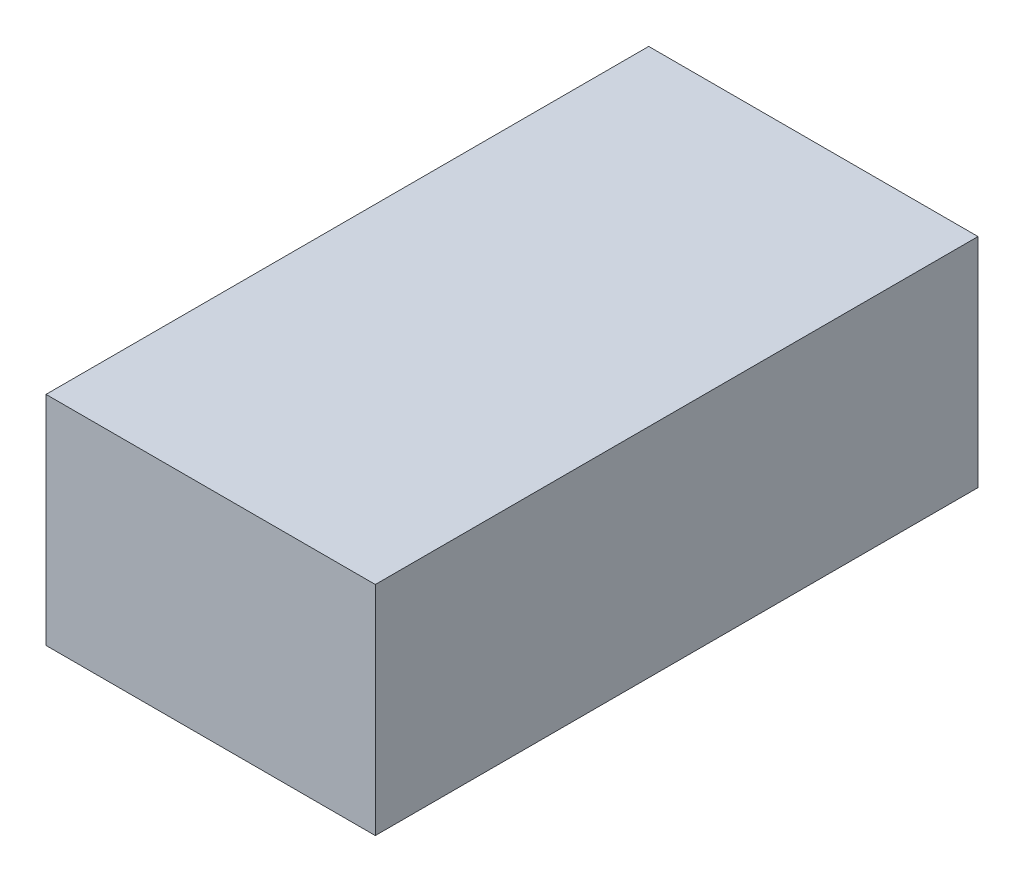
ISO-10303-21;
HEADER;
FILE_DESCRIPTION(('STEP AP214'),'2;1');
FILE_NAME('part.step','',(''),(''),'','','');
FILE_SCHEMA(('AUTOMOTIVE_DESIGN { 1 0 10303 214 1 1 1 1 }'));
ENDSEC;
DATA;
#1=APPLICATION_CONTEXT('core data for automotive mechanical design processes');
#2=APPLICATION_PROTOCOL_DEFINITION('international standard','automotive_design',2000,#1);
#3=PRODUCT_CONTEXT('',#1,'mechanical');
#4=PRODUCT('Part','Part','',(#3));
#5=PRODUCT_RELATED_PRODUCT_CATEGORY('part','',(#4));
#6=PRODUCT_DEFINITION_FORMATION('','',#4);
#7=PRODUCT_DEFINITION_CONTEXT('part definition',#1,'design');
#8=PRODUCT_DEFINITION('design','',#6,#7);
#9=PRODUCT_DEFINITION_SHAPE('','',#8);
#10=(LENGTH_UNIT() NAMED_UNIT(*) SI_UNIT(.MILLI.,.METRE.));
#11=(NAMED_UNIT(*) PLANE_ANGLE_UNIT() SI_UNIT($,.RADIAN.));
#12=(NAMED_UNIT(*) SI_UNIT($,.STERADIAN.) SOLID_ANGLE_UNIT());
#13=UNCERTAINTY_MEASURE_WITH_UNIT(LENGTH_MEASURE(1.E-05),#10,'distance_accuracy_value','');
#14=(GEOMETRIC_REPRESENTATION_CONTEXT(3) GLOBAL_UNCERTAINTY_ASSIGNED_CONTEXT((#13)) GLOBAL_UNIT_ASSIGNED_CONTEXT((#10,
#11,#12)) REPRESENTATION_CONTEXT('',''));
#15=CARTESIAN_POINT('',(0.,0.,0.));
#16=DIRECTION('',(0.,0.,1.));
#17=DIRECTION('',(1.,0.,0.));
#18=AXIS2_PLACEMENT_3D('',#15,#16,#17);
#19=CARTESIAN_POINT('',(0.,0.,48.5));
#20=DIRECTION('',(1.,0.,0.));
#21=DIRECTION('',(0.,1.,0.));
#22=AXIS2_PLACEMENT_3D('',#19,#20,#21);
#23=PLANE('',#22);
#24=DIRECTION('',(0.,-1.,0.));
#25=VECTOR('',#24,1.);
#26=CARTESIAN_POINT('',(0.,0.,0.));
#27=LINE('',#26,#25);
#28=CARTESIAN_POINT('',(0.,0.,0.));
#29=VERTEX_POINT('',#28);
#30=CARTESIAN_POINT('',(0.,-17.5,0.));
#31=VERTEX_POINT('',#30);
#32=EDGE_CURVE('E96',#29,#31,#27,.T.);
#33=ORIENTED_EDGE('',*,*,#32,.T.);
#34=DIRECTION('',(0.,0.,-1.));
#35=VECTOR('',#34,1.);
#36=CARTESIAN_POINT('',(0.,-17.5,48.5));
#37=LINE('',#36,#35);
#38=CARTESIAN_POINT('',(0.,-17.5,48.5));
#39=VERTEX_POINT('',#38);
#40=EDGE_CURVE('E11',#39,#31,#37,.T.);
#41=ORIENTED_EDGE('',*,*,#40,.F.);
#42=DIRECTION('',(0.,-1.,0.));
#43=VECTOR('',#42,1.);
#44=CARTESIAN_POINT('',(0.,0.,48.5));
#45=LINE('',#44,#43);
#46=CARTESIAN_POINT('',(0.,0.,48.5));
#47=VERTEX_POINT('',#46);
#48=EDGE_CURVE('E84',#47,#39,#45,.T.);
#49=ORIENTED_EDGE('',*,*,#48,.F.);
#50=DIRECTION('',(0.,0.,-1.));
#51=VECTOR('',#50,1.);
#52=CARTESIAN_POINT('',(0.,0.,48.5));
#53=LINE('',#52,#51);
#54=EDGE_CURVE('E92',#47,#29,#53,.T.);
#55=ORIENTED_EDGE('',*,*,#54,.T.);
#56=EDGE_LOOP('',(#33,#41,#49,#55));
#57=FACE_BOUND('',#56,.T.);
#58=ADVANCED_FACE('F33',(#57),#23,.F.);
#59=CARTESIAN_POINT('',(0.,-17.5,48.5));
#60=DIRECTION('',(0.,1.,0.));
#61=DIRECTION('',(0.,0.,1.));
#62=AXIS2_PLACEMENT_3D('',#59,#60,#61);
#63=PLANE('',#62);
#64=DIRECTION('',(1.,0.,0.));
#65=VECTOR('',#64,1.);
#66=CARTESIAN_POINT('',(0.,-17.5,0.));
#67=LINE('',#66,#65);
#68=CARTESIAN_POINT('',(26.5,-17.5,0.));
#69=VERTEX_POINT('',#68);
#70=EDGE_CURVE('E88',#31,#69,#67,.T.);
#71=ORIENTED_EDGE('',*,*,#70,.T.);
#72=DIRECTION('',(0.,0.,-1.));
#73=VECTOR('',#72,1.);
#74=CARTESIAN_POINT('',(26.5,-17.5,48.5));
#75=LINE('',#74,#73);
#76=CARTESIAN_POINT('',(26.5,-17.5,48.5));
#77=VERTEX_POINT('',#76);
#78=EDGE_CURVE('E41',#77,#69,#75,.T.);
#79=ORIENTED_EDGE('',*,*,#78,.F.);
#80=DIRECTION('',(1.,0.,0.));
#81=VECTOR('',#80,1.);
#82=CARTESIAN_POINT('',(0.,-17.5,48.5));
#83=LINE('',#82,#81);
#84=EDGE_CURVE('E79',#39,#77,#83,.T.);
#85=ORIENTED_EDGE('',*,*,#84,.F.);
#86=ORIENTED_EDGE('',*,*,#40,.T.);
#87=EDGE_LOOP('',(#71,#79,#85,#86));
#88=FACE_BOUND('',#87,.T.);
#89=ADVANCED_FACE('F87',(#88),#63,.F.);
#90=CARTESIAN_POINT('',(26.5,0.,48.5));
#91=DIRECTION('',(-1.,0.,0.));
#92=DIRECTION('',(0.,0.,1.));
#93=AXIS2_PLACEMENT_3D('',#90,#91,#92);
#94=PLANE('',#93);
#95=DIRECTION('',(0.,1.,0.));
#96=VECTOR('',#95,1.);
#97=CARTESIAN_POINT('',(26.5,0.,0.));
#98=LINE('',#97,#96);
#99=CARTESIAN_POINT('',(26.5,0.,0.));
#100=VERTEX_POINT('',#99);
#101=EDGE_CURVE('E66',#69,#100,#98,.T.);
#102=ORIENTED_EDGE('',*,*,#101,.T.);
#103=DIRECTION('',(0.,0.,-1.));
#104=VECTOR('',#103,1.);
#105=CARTESIAN_POINT('',(26.5,0.,48.5));
#106=LINE('',#105,#104);
#107=CARTESIAN_POINT('',(26.5,0.,48.5));
#108=VERTEX_POINT('',#107);
#109=EDGE_CURVE('E89',#108,#100,#106,.T.);
#110=ORIENTED_EDGE('',*,*,#109,.F.);
#111=DIRECTION('',(0.,1.,0.));
#112=VECTOR('',#111,1.);
#113=CARTESIAN_POINT('',(26.5,0.,48.5));
#114=LINE('',#113,#112);
#115=EDGE_CURVE('E82',#77,#108,#114,.T.);
#116=ORIENTED_EDGE('',*,*,#115,.F.);
#117=ORIENTED_EDGE('',*,*,#78,.T.);
#118=EDGE_LOOP('',(#102,#110,#116,#117));
#119=FACE_BOUND('',#118,.T.);
#120=ADVANCED_FACE('F90',(#119),#94,.F.);
#121=CARTESIAN_POINT('',(0.,0.,48.5));
#122=DIRECTION('',(0.,-1.,0.));
#123=DIRECTION('',(0.,0.,-1.));
#124=AXIS2_PLACEMENT_3D('',#121,#122,#123);
#125=PLANE('',#124);
#126=DIRECTION('',(-1.,0.,0.));
#127=VECTOR('',#126,1.);
#128=CARTESIAN_POINT('',(0.,0.,0.));
#129=LINE('',#128,#127);
#130=EDGE_CURVE('E72',#100,#29,#129,.T.);
#131=ORIENTED_EDGE('',*,*,#130,.T.);
#132=ORIENTED_EDGE('',*,*,#54,.F.);
#133=DIRECTION('',(-1.,0.,0.));
#134=VECTOR('',#133,1.);
#135=CARTESIAN_POINT('',(0.,0.,48.5));
#136=LINE('',#135,#134);
#137=EDGE_CURVE('E49',#108,#47,#136,.T.);
#138=ORIENTED_EDGE('',*,*,#137,.F.);
#139=ORIENTED_EDGE('',*,*,#109,.T.);
#140=EDGE_LOOP('',(#131,#132,#138,#139));
#141=FACE_BOUND('',#140,.T.);
#142=ADVANCED_FACE('F103',(#141),#125,.F.);
#143=CARTESIAN_POINT('',(0.,0.,48.5));
#144=DIRECTION('',(0.,0.,1.));
#145=DIRECTION('',(1.,0.,0.));
#146=AXIS2_PLACEMENT_3D('',#143,#144,#145);
#147=PLANE('',#146);
#148=ORIENTED_EDGE('',*,*,#48,.T.);
#149=ORIENTED_EDGE('',*,*,#84,.T.);
#150=ORIENTED_EDGE('',*,*,#115,.T.);
#151=ORIENTED_EDGE('',*,*,#137,.T.);
#152=EDGE_LOOP('',(#148,#149,#150,#151));
#153=FACE_BOUND('',#152,.T.);
#154=ADVANCED_FACE('F80',(#153),#147,.T.);
#155=CARTESIAN_POINT('',(0.,0.,0.));
#156=DIRECTION('',(0.,0.,1.));
#157=DIRECTION('',(1.,0.,0.));
#158=AXIS2_PLACEMENT_3D('',#155,#156,#157);
#159=PLANE('',#158);
#160=ORIENTED_EDGE('',*,*,#32,.F.);
#161=ORIENTED_EDGE('',*,*,#130,.F.);
#162=ORIENTED_EDGE('',*,*,#101,.F.);
#163=ORIENTED_EDGE('',*,*,#70,.F.);
#164=EDGE_LOOP('',(#160,#161,#162,#163));
#165=FACE_BOUND('',#164,.T.);
#166=ADVANCED_FACE('F106',(#165),#159,.F.);
#167=CLOSED_SHELL('',(#58,#89,#120,#142,#154,#166));
#168=MANIFOLD_SOLID_BREP('B2',#167);
#169=ADVANCED_BREP_SHAPE_REPRESENTATION('',(#18,#168),#14);
#170=SHAPE_DEFINITION_REPRESENTATION(#9,#169);
ENDSEC;
END-ISO-10303-21;
